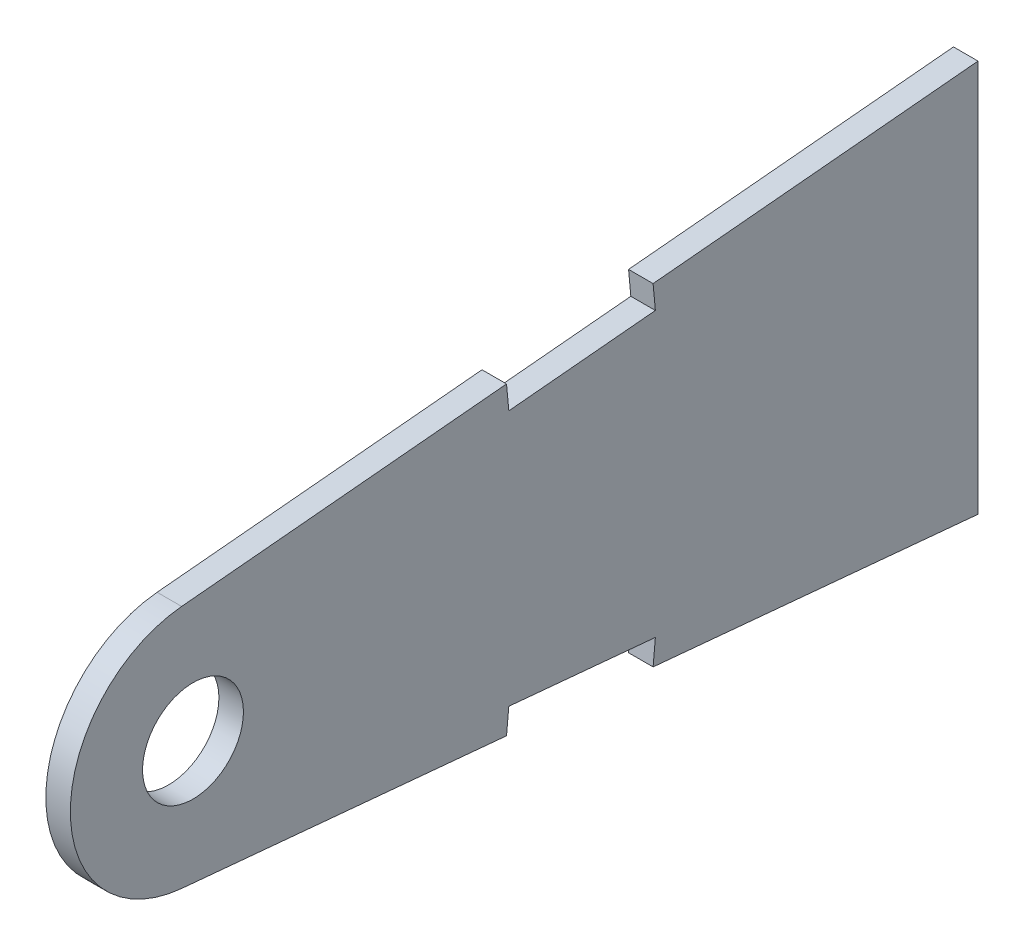
ISO-10303-21;
HEADER;
FILE_DESCRIPTION(('STEP AP214'),'2;1');
FILE_NAME('part.step','',(''),(''),'','','');
FILE_SCHEMA(('AUTOMOTIVE_DESIGN { 1 0 10303 214 1 1 1 1 }'));
ENDSEC;
DATA;
#1=APPLICATION_CONTEXT('core data for automotive mechanical design processes');
#2=APPLICATION_PROTOCOL_DEFINITION('international standard','automotive_design',2000,#1);
#3=PRODUCT_CONTEXT('',#1,'mechanical');
#4=PRODUCT('Part','Part','',(#3));
#5=PRODUCT_RELATED_PRODUCT_CATEGORY('part','',(#4));
#6=PRODUCT_DEFINITION_FORMATION('','',#4);
#7=PRODUCT_DEFINITION_CONTEXT('part definition',#1,'design');
#8=PRODUCT_DEFINITION('design','',#6,#7);
#9=PRODUCT_DEFINITION_SHAPE('','',#8);
#10=(LENGTH_UNIT() NAMED_UNIT(*) SI_UNIT(.MILLI.,.METRE.));
#11=(NAMED_UNIT(*) PLANE_ANGLE_UNIT() SI_UNIT($,.RADIAN.));
#12=(NAMED_UNIT(*) SI_UNIT($,.STERADIAN.) SOLID_ANGLE_UNIT());
#13=UNCERTAINTY_MEASURE_WITH_UNIT(LENGTH_MEASURE(1.E-05),#10,'distance_accuracy_value','');
#14=(GEOMETRIC_REPRESENTATION_CONTEXT(3) GLOBAL_UNCERTAINTY_ASSIGNED_CONTEXT((#13)) GLOBAL_UNIT_ASSIGNED_CONTEXT((#10,
#11,#12)) REPRESENTATION_CONTEXT('',''));
#15=CARTESIAN_POINT('',(0.,0.,0.));
#16=DIRECTION('',(0.,0.,1.));
#17=DIRECTION('',(1.,0.,0.));
#18=AXIS2_PLACEMENT_3D('',#15,#16,#17);
#19=CARTESIAN_POINT('',(1.5875,0.,0.));
#20=DIRECTION('',(-1.,0.,0.));
#21=DIRECTION('',(0.,0.,1.));
#22=AXIS2_PLACEMENT_3D('',#19,#20,#21);
#23=CYLINDRICAL_SURFACE('',#22,7.93750000000001);
#24=CARTESIAN_POINT('',(0.,0.,0.));
#25=DIRECTION('',(1.,0.,0.));
#26=DIRECTION('',(0.,0.,-1.));
#27=AXIS2_PLACEMENT_3D('',#24,#25,#26);
#28=CIRCLE('',#27,7.93750000000001);
#29=CARTESIAN_POINT('',(0.,7.90334091594281,0.735600853985699));
#30=VERTEX_POINT('',#29);
#31=CARTESIAN_POINT('',(0.,-7.90334091594281,0.735600853985699));
#32=VERTEX_POINT('',#31);
#33=EDGE_CURVE('E153',#30,#32,#28,.T.);
#34=ORIENTED_EDGE('',*,*,#33,.T.);
#35=DIRECTION('',(-1.,0.,0.));
#36=VECTOR('',#35,1.);
#37=CARTESIAN_POINT('',(1.5875,-7.90334091594281,0.735600853985699));
#38=LINE('',#37,#36);
#39=CARTESIAN_POINT('',(1.5875,-7.90334091594281,0.735600853985699));
#40=VERTEX_POINT('',#39);
#41=EDGE_CURVE('E11',#40,#32,#38,.T.);
#42=ORIENTED_EDGE('',*,*,#41,.F.);
#43=CARTESIAN_POINT('',(1.5875,0.,0.));
#44=DIRECTION('',(1.,0.,0.));
#45=DIRECTION('',(0.,0.,-1.));
#46=AXIS2_PLACEMENT_3D('',#43,#44,#45);
#47=CIRCLE('',#46,7.93750000000001);
#48=CARTESIAN_POINT('',(1.5875,7.90334091594281,0.735600853985699));
#49=VERTEX_POINT('',#48);
#50=EDGE_CURVE('E234',#49,#40,#47,.T.);
#51=ORIENTED_EDGE('',*,*,#50,.F.);
#52=DIRECTION('',(-1.,0.,0.));
#53=VECTOR('',#52,1.);
#54=CARTESIAN_POINT('',(1.5875,7.90334091594281,0.735600853985699));
#55=LINE('',#54,#53);
#56=EDGE_CURVE('E148',#49,#30,#55,.T.);
#57=ORIENTED_EDGE('',*,*,#56,.T.);
#58=EDGE_LOOP('',(#34,#42,#51,#57));
#59=FACE_BOUND('',#58,.T.);
#60=ADVANCED_FACE('F34',(#59),#23,.T.);
#61=CARTESIAN_POINT('',(1.5875,-7.90334091594281,0.735600853985698));
#62=DIRECTION('',(0.,0.995696493347124,-0.0926741233367807));
#63=DIRECTION('',(0.,0.0926741233367807,0.995696493347124));
#64=AXIS2_PLACEMENT_3D('',#61,#62,#63);
#65=PLANE('',#64);
#66=DIRECTION('',(0.,-0.0926741233367807,-0.995696493347124));
#67=VECTOR('',#66,1.);
#68=CARTESIAN_POINT('',(0.,-7.90334091594281,0.735600853985698));
#69=LINE('',#68,#67);
#70=CARTESIAN_POINT('',(0.,-9.86030994557999,-20.2901950234415));
#71=VERTEX_POINT('',#70);
#72=EDGE_CURVE('E156',#32,#71,#69,.T.);
#73=ORIENTED_EDGE('',*,*,#72,.T.);
#74=DIRECTION('',(-1.,0.,0.));
#75=VECTOR('',#74,1.);
#76=CARTESIAN_POINT('',(1.5875,-9.86030994557999,-20.2901950234415));
#77=LINE('',#76,#75);
#78=CARTESIAN_POINT('',(1.5875,-9.86030994557999,-20.2901950234415));
#79=VERTEX_POINT('',#78);
#80=EDGE_CURVE('E42',#79,#71,#77,.T.);
#81=ORIENTED_EDGE('',*,*,#80,.F.);
#82=DIRECTION('',(0.,-0.0926741233367807,-0.995696493347124));
#83=VECTOR('',#82,1.);
#84=CARTESIAN_POINT('',(1.5875,-7.90334091594281,0.735600853985698));
#85=LINE('',#84,#83);
#86=EDGE_CURVE('E101',#40,#79,#85,.T.);
#87=ORIENTED_EDGE('',*,*,#86,.F.);
#88=ORIENTED_EDGE('',*,*,#41,.T.);
#89=EDGE_LOOP('',(#73,#81,#87,#88));
#90=FACE_BOUND('',#89,.T.);
#91=ADVANCED_FACE('F259',(#90),#65,.F.);
#92=CARTESIAN_POINT('',(1.5875,-1.95696902963718,-21.0257958774272));
#93=DIRECTION('',(0.,0.0926741233367808,0.995696493347124));
#94=DIRECTION('',(0.,-0.995696493347124,0.0926741233367808));
#95=AXIS2_PLACEMENT_3D('',#92,#93,#94);
#96=PLANE('',#95);
#97=DIRECTION('',(0.,0.995696493347124,-0.0926741233367808));
#98=VECTOR('',#97,1.);
#99=CARTESIAN_POINT('',(0.,-1.95696902963718,-21.0257958774272));
#100=LINE('',#99,#98);
#101=CARTESIAN_POINT('',(0.,-8.27964176239126,-20.4373151942386));
#102=VERTEX_POINT('',#101);
#103=EDGE_CURVE('E159',#71,#102,#100,.T.);
#104=ORIENTED_EDGE('',*,*,#103,.T.);
#105=DIRECTION('',(-1.,0.,0.));
#106=VECTOR('',#105,1.);
#107=CARTESIAN_POINT('',(1.5875,-8.27964176239126,-20.4373151942386));
#108=LINE('',#107,#106);
#109=CARTESIAN_POINT('',(1.5875,-8.27964176239126,-20.4373151942386));
#110=VERTEX_POINT('',#109);
#111=EDGE_CURVE('E194',#110,#102,#108,.T.);
#112=ORIENTED_EDGE('',*,*,#111,.F.);
#113=DIRECTION('',(0.,0.995696493347124,-0.0926741233367808));
#114=VECTOR('',#113,1.);
#115=CARTESIAN_POINT('',(1.5875,-1.95696902963718,-21.0257958774272));
#116=LINE('',#115,#114);
#117=EDGE_CURVE('E202',#79,#110,#116,.T.);
#118=ORIENTED_EDGE('',*,*,#117,.F.);
#119=ORIENTED_EDGE('',*,*,#80,.T.);
#120=EDGE_LOOP('',(#104,#112,#118,#119));
#121=FACE_BOUND('',#120,.T.);
#122=ADVANCED_FACE('F200',(#121),#96,.F.);
#123=CARTESIAN_POINT('',(1.5875,-6.32267273275409,0.588480683188544));
#124=DIRECTION('',(0.,0.995696493347124,-0.0926741233367807));
#125=DIRECTION('',(0.,0.0926741233367807,0.995696493347124));
#126=AXIS2_PLACEMENT_3D('',#123,#124,#125);
#127=PLANE('',#126);
#128=DIRECTION('',(0.,-0.0926741233367807,-0.995696493347124));
#129=VECTOR('',#128,1.);
#130=CARTESIAN_POINT('',(0.,-6.32267273275409,0.588480683188544));
#131=LINE('',#130,#129);
#132=CARTESIAN_POINT('',(0.,-9.1623627871741,-29.92132429337));
#133=VERTEX_POINT('',#132);
#134=EDGE_CURVE('E162',#102,#133,#131,.T.);
#135=ORIENTED_EDGE('',*,*,#134,.T.);
#136=DIRECTION('',(-1.,0.,0.));
#137=VECTOR('',#136,1.);
#138=CARTESIAN_POINT('',(1.5875,-9.1623627871741,-29.92132429337));
#139=LINE('',#138,#137);
#140=CARTESIAN_POINT('',(1.5875,-9.1623627871741,-29.92132429337));
#141=VERTEX_POINT('',#140);
#142=EDGE_CURVE('E192',#141,#133,#139,.T.);
#143=ORIENTED_EDGE('',*,*,#142,.F.);
#144=DIRECTION('',(0.,-0.0926741233367807,-0.995696493347124));
#145=VECTOR('',#144,1.);
#146=CARTESIAN_POINT('',(1.5875,-6.32267273275409,0.588480683188544));
#147=LINE('',#146,#145);
#148=EDGE_CURVE('E214',#110,#141,#147,.T.);
#149=ORIENTED_EDGE('',*,*,#148,.F.);
#150=ORIENTED_EDGE('',*,*,#111,.T.);
#151=EDGE_LOOP('',(#135,#143,#149,#150));
#152=FACE_BOUND('',#151,.T.);
#153=ADVANCED_FACE('F211',(#152),#127,.F.);
#154=CARTESIAN_POINT('',(1.5875,-2.83969005442002,-30.5098049765585));
#155=DIRECTION('',(0.,0.0926741233367808,0.995696493347124));
#156=DIRECTION('',(0.,-0.995696493347124,0.0926741233367808));
#157=AXIS2_PLACEMENT_3D('',#154,#155,#156);
#158=PLANE('',#157);
#159=DIRECTION('',(0.,0.995696493347124,-0.0926741233367808));
#160=VECTOR('',#159,1.);
#161=CARTESIAN_POINT('',(0.,-2.83969005442002,-30.5098049765585));
#162=LINE('',#161,#160);
#163=CARTESIAN_POINT('',(0.,-10.7430309703628,-29.7742041225728));
#164=VERTEX_POINT('',#163);
#165=EDGE_CURVE('E165',#164,#133,#162,.T.);
#166=ORIENTED_EDGE('',*,*,#165,.F.);
#167=DIRECTION('',(-1.,0.,0.));
#168=VECTOR('',#167,1.);
#169=CARTESIAN_POINT('',(1.5875,-10.7430309703628,-29.7742041225728));
#170=LINE('',#169,#168);
#171=CARTESIAN_POINT('',(1.5875,-10.7430309703628,-29.7742041225728));
#172=VERTEX_POINT('',#171);
#173=EDGE_CURVE('E190',#172,#164,#170,.T.);
#174=ORIENTED_EDGE('',*,*,#173,.F.);
#175=DIRECTION('',(0.,0.995696493347124,-0.0926741233367808));
#176=VECTOR('',#175,1.);
#177=CARTESIAN_POINT('',(1.5875,-2.83969005442002,-30.5098049765585));
#178=LINE('',#177,#176);
#179=EDGE_CURVE('E216',#172,#141,#178,.T.);
#180=ORIENTED_EDGE('',*,*,#179,.T.);
#181=ORIENTED_EDGE('',*,*,#142,.T.);
#182=EDGE_LOOP('',(#166,#174,#180,#181));
#183=FACE_BOUND('',#182,.T.);
#184=ADVANCED_FACE('F273',(#183),#158,.T.);
#185=CARTESIAN_POINT('',(0.,-12.7,-50.8));
#186=VERTEX_POINT('',#185);
#187=EDGE_CURVE('E160',#164,#186,#69,.T.);
#188=ORIENTED_EDGE('',*,*,#187,.T.);
#189=DIRECTION('',(-1.,0.,0.));
#190=VECTOR('',#189,1.);
#191=CARTESIAN_POINT('',(1.5875,-12.7,-50.8));
#192=LINE('',#191,#190);
#193=CARTESIAN_POINT('',(1.5875,-12.7,-50.8));
#194=VERTEX_POINT('',#193);
#195=EDGE_CURVE('E187',#194,#186,#192,.T.);
#196=ORIENTED_EDGE('',*,*,#195,.F.);
#197=EDGE_CURVE('E218',#172,#194,#85,.T.);
#198=ORIENTED_EDGE('',*,*,#197,.F.);
#199=ORIENTED_EDGE('',*,*,#173,.T.);
#200=EDGE_LOOP('',(#188,#196,#198,#199));
#201=FACE_BOUND('',#200,.T.);
#202=ADVANCED_FACE('F265',(#201),#65,.F.);
#203=CARTESIAN_POINT('',(1.5875,0.,-50.8));
#204=DIRECTION('',(0.,0.,1.));
#205=DIRECTION('',(1.,0.,0.));
#206=AXIS2_PLACEMENT_3D('',#203,#204,#205);
#207=PLANE('',#206);
#208=DIRECTION('',(0.,1.,0.));
#209=VECTOR('',#208,1.);
#210=CARTESIAN_POINT('',(0.,0.,-50.8));
#211=LINE('',#210,#209);
#212=CARTESIAN_POINT('',(0.,12.7,-50.8));
#213=VERTEX_POINT('',#212);
#214=EDGE_CURVE('E168',#186,#213,#211,.T.);
#215=ORIENTED_EDGE('',*,*,#214,.T.);
#216=DIRECTION('',(-1.,0.,0.));
#217=VECTOR('',#216,1.);
#218=CARTESIAN_POINT('',(1.5875,12.7,-50.8));
#219=LINE('',#218,#217);
#220=CARTESIAN_POINT('',(1.5875,12.7,-50.8));
#221=VERTEX_POINT('',#220);
#222=EDGE_CURVE('E184',#221,#213,#219,.T.);
#223=ORIENTED_EDGE('',*,*,#222,.F.);
#224=DIRECTION('',(0.,1.,0.));
#225=VECTOR('',#224,1.);
#226=CARTESIAN_POINT('',(1.5875,0.,-50.8));
#227=LINE('',#226,#225);
#228=EDGE_CURVE('E223',#194,#221,#227,.T.);
#229=ORIENTED_EDGE('',*,*,#228,.F.);
#230=ORIENTED_EDGE('',*,*,#195,.T.);
#231=EDGE_LOOP('',(#215,#223,#229,#230));
#232=FACE_BOUND('',#231,.T.);
#233=ADVANCED_FACE('F272',(#232),#207,.F.);
#234=CARTESIAN_POINT('',(1.5875,7.90334091594281,0.735600853985698));
#235=DIRECTION('',(0.,-0.995696493347124,-0.0926741233367807));
#236=DIRECTION('',(0.,0.0926741233367807,-0.995696493347124));
#237=AXIS2_PLACEMENT_3D('',#234,#235,#236);
#238=PLANE('',#237);
#239=DIRECTION('',(0.,-0.0926741233367807,0.995696493347124));
#240=VECTOR('',#239,1.);
#241=CARTESIAN_POINT('',(0.,7.90334091594281,0.735600853985698));
#242=LINE('',#241,#240);
#243=CARTESIAN_POINT('',(0.,10.7430309703628,-29.7742041225728));
#244=VERTEX_POINT('',#243);
#245=EDGE_CURVE('E170',#213,#244,#242,.T.);
#246=ORIENTED_EDGE('',*,*,#245,.T.);
#247=DIRECTION('',(-1.,0.,0.));
#248=VECTOR('',#247,1.);
#249=CARTESIAN_POINT('',(1.5875,10.7430309703628,-29.7742041225728));
#250=LINE('',#249,#248);
#251=CARTESIAN_POINT('',(1.5875,10.7430309703628,-29.7742041225728));
#252=VERTEX_POINT('',#251);
#253=EDGE_CURVE('E181',#252,#244,#250,.T.);
#254=ORIENTED_EDGE('',*,*,#253,.F.);
#255=DIRECTION('',(0.,-0.0926741233367807,0.995696493347124));
#256=VECTOR('',#255,1.);
#257=CARTESIAN_POINT('',(1.5875,7.90334091594281,0.735600853985698));
#258=LINE('',#257,#256);
#259=EDGE_CURVE('E150',#221,#252,#258,.T.);
#260=ORIENTED_EDGE('',*,*,#259,.F.);
#261=ORIENTED_EDGE('',*,*,#222,.T.);
#262=EDGE_LOOP('',(#246,#254,#260,#261));
#263=FACE_BOUND('',#262,.T.);
#264=ADVANCED_FACE('F229',(#263),#238,.F.);
#265=CARTESIAN_POINT('',(1.5875,2.83969005442002,-30.5098049765585));
#266=DIRECTION('',(0.,0.0926741233367808,-0.995696493347124));
#267=DIRECTION('',(0.,0.995696493347124,0.0926741233367808));
#268=AXIS2_PLACEMENT_3D('',#265,#266,#267);
#269=PLANE('',#268);
#270=DIRECTION('',(0.,-0.995696493347124,-0.0926741233367808));
#271=VECTOR('',#270,1.);
#272=CARTESIAN_POINT('',(0.,2.83969005442002,-30.5098049765585));
#273=LINE('',#272,#271);
#274=CARTESIAN_POINT('',(0.,9.1623627871741,-29.92132429337));
#275=VERTEX_POINT('',#274);
#276=EDGE_CURVE('E172',#244,#275,#273,.T.);
#277=ORIENTED_EDGE('',*,*,#276,.T.);
#278=DIRECTION('',(-1.,0.,0.));
#279=VECTOR('',#278,1.);
#280=CARTESIAN_POINT('',(1.5875,9.1623627871741,-29.92132429337));
#281=LINE('',#280,#279);
#282=CARTESIAN_POINT('',(1.5875,9.1623627871741,-29.92132429337));
#283=VERTEX_POINT('',#282);
#284=EDGE_CURVE('E138',#283,#275,#281,.T.);
#285=ORIENTED_EDGE('',*,*,#284,.F.);
#286=DIRECTION('',(0.,-0.995696493347124,-0.0926741233367808));
#287=VECTOR('',#286,1.);
#288=CARTESIAN_POINT('',(1.5875,2.83969005442002,-30.5098049765585));
#289=LINE('',#288,#287);
#290=EDGE_CURVE('E143',#252,#283,#289,.T.);
#291=ORIENTED_EDGE('',*,*,#290,.F.);
#292=ORIENTED_EDGE('',*,*,#253,.T.);
#293=EDGE_LOOP('',(#277,#285,#291,#292));
#294=FACE_BOUND('',#293,.T.);
#295=ADVANCED_FACE('F233',(#294),#269,.F.);
#296=CARTESIAN_POINT('',(1.5875,6.32267273275409,0.588480683188544));
#297=DIRECTION('',(0.,0.995696493347124,0.0926741233367807));
#298=DIRECTION('',(0.,-0.0926741233367807,0.995696493347124));
#299=AXIS2_PLACEMENT_3D('',#296,#297,#298);
#300=PLANE('',#299);
#301=DIRECTION('',(0.,0.0926741233367807,-0.995696493347124));
#302=VECTOR('',#301,1.);
#303=CARTESIAN_POINT('',(0.,6.32267273275409,0.588480683188544));
#304=LINE('',#303,#302);
#305=CARTESIAN_POINT('',(0.,8.27964176239126,-20.4373151942386));
#306=VERTEX_POINT('',#305);
#307=EDGE_CURVE('E133',#306,#275,#304,.T.);
#308=ORIENTED_EDGE('',*,*,#307,.F.);
#309=DIRECTION('',(-1.,0.,0.));
#310=VECTOR('',#309,1.);
#311=CARTESIAN_POINT('',(1.5875,8.27964176239126,-20.4373151942386));
#312=LINE('',#311,#310);
#313=CARTESIAN_POINT('',(1.5875,8.27964176239126,-20.4373151942386));
#314=VERTEX_POINT('',#313);
#315=EDGE_CURVE('E128',#314,#306,#312,.T.);
#316=ORIENTED_EDGE('',*,*,#315,.F.);
#317=DIRECTION('',(0.,0.0926741233367807,-0.995696493347124));
#318=VECTOR('',#317,1.);
#319=CARTESIAN_POINT('',(1.5875,6.32267273275409,0.588480683188544));
#320=LINE('',#319,#318);
#321=EDGE_CURVE('E131',#314,#283,#320,.T.);
#322=ORIENTED_EDGE('',*,*,#321,.T.);
#323=ORIENTED_EDGE('',*,*,#284,.T.);
#324=EDGE_LOOP('',(#308,#316,#322,#323));
#325=FACE_BOUND('',#324,.T.);
#326=ADVANCED_FACE('F130',(#325),#300,.T.);
#327=CARTESIAN_POINT('',(1.5875,1.95696902963718,-21.0257958774272));
#328=DIRECTION('',(0.,0.0926741233367808,-0.995696493347124));
#329=DIRECTION('',(0.,0.995696493347124,0.0926741233367808));
#330=AXIS2_PLACEMENT_3D('',#327,#328,#329);
#331=PLANE('',#330);
#332=DIRECTION('',(0.,-0.995696493347124,-0.0926741233367808));
#333=VECTOR('',#332,1.);
#334=CARTESIAN_POINT('',(0.,1.95696902963718,-21.0257958774272));
#335=LINE('',#334,#333);
#336=CARTESIAN_POINT('',(0.,9.86030994557999,-20.2901950234415));
#337=VERTEX_POINT('',#336);
#338=EDGE_CURVE('E176',#337,#306,#335,.T.);
#339=ORIENTED_EDGE('',*,*,#338,.F.);
#340=DIRECTION('',(-1.,0.,0.));
#341=VECTOR('',#340,1.);
#342=CARTESIAN_POINT('',(1.5875,9.86030994557999,-20.2901950234415));
#343=LINE('',#342,#341);
#344=CARTESIAN_POINT('',(1.5875,9.86030994557999,-20.2901950234415));
#345=VERTEX_POINT('',#344);
#346=EDGE_CURVE('E90',#345,#337,#343,.T.);
#347=ORIENTED_EDGE('',*,*,#346,.F.);
#348=DIRECTION('',(0.,-0.995696493347124,-0.0926741233367808));
#349=VECTOR('',#348,1.);
#350=CARTESIAN_POINT('',(1.5875,1.95696902963718,-21.0257958774272));
#351=LINE('',#350,#349);
#352=EDGE_CURVE('E141',#345,#314,#351,.T.);
#353=ORIENTED_EDGE('',*,*,#352,.T.);
#354=ORIENTED_EDGE('',*,*,#315,.T.);
#355=EDGE_LOOP('',(#339,#347,#353,#354));
#356=FACE_BOUND('',#355,.T.);
#357=ADVANCED_FACE('F146',(#356),#331,.T.);
#358=EDGE_CURVE('E93',#337,#30,#242,.T.);
#359=ORIENTED_EDGE('',*,*,#358,.T.);
#360=ORIENTED_EDGE('',*,*,#56,.F.);
#361=EDGE_CURVE('E50',#345,#49,#258,.T.);
#362=ORIENTED_EDGE('',*,*,#361,.F.);
#363=ORIENTED_EDGE('',*,*,#346,.T.);
#364=EDGE_LOOP('',(#359,#360,#362,#363));
#365=FACE_BOUND('',#364,.T.);
#366=ADVANCED_FACE('F248',(#365),#238,.F.);
#367=CARTESIAN_POINT('',(1.5875,0.,0.));
#368=DIRECTION('',(1.,0.,0.));
#369=DIRECTION('',(0.,0.,-1.));
#370=AXIS2_PLACEMENT_3D('',#367,#368,#369);
#371=PLANE('',#370);
#372=CARTESIAN_POINT('',(1.5875,0.,0.));
#373=DIRECTION('',(1.,0.,0.));
#374=DIRECTION('',(0.,0.,-1.));
#375=AXIS2_PLACEMENT_3D('',#372,#373,#374);
#376=CIRCLE('',#375,3.2639);
#377=CARTESIAN_POINT('',(1.5875,0.,-3.2639));
#378=VERTEX_POINT('',#377);
#379=EDGE_CURVE('E241',#378,#378,#376,.T.);
#380=ORIENTED_EDGE('',*,*,#379,.F.);
#381=EDGE_LOOP('',(#380));
#382=FACE_BOUND('',#381,.T.);
#383=ORIENTED_EDGE('',*,*,#50,.T.);
#384=ORIENTED_EDGE('',*,*,#86,.T.);
#385=ORIENTED_EDGE('',*,*,#117,.T.);
#386=ORIENTED_EDGE('',*,*,#148,.T.);
#387=ORIENTED_EDGE('',*,*,#179,.F.);
#388=ORIENTED_EDGE('',*,*,#197,.T.);
#389=ORIENTED_EDGE('',*,*,#228,.T.);
#390=ORIENTED_EDGE('',*,*,#259,.T.);
#391=ORIENTED_EDGE('',*,*,#290,.T.);
#392=ORIENTED_EDGE('',*,*,#321,.F.);
#393=ORIENTED_EDGE('',*,*,#352,.F.);
#394=ORIENTED_EDGE('',*,*,#361,.T.);
#395=EDGE_LOOP('',(#383,#384,#385,#386,#387,#388,#389,#390,#391,#392,#393,#394));
#396=FACE_BOUND('',#395,.T.);
#397=ADVANCED_FACE('F140',(#382,#396),#371,.T.);
#398=CARTESIAN_POINT('',(0.,0.,0.));
#399=DIRECTION('',(1.,0.,0.));
#400=DIRECTION('',(0.,0.,-1.));
#401=AXIS2_PLACEMENT_3D('',#398,#399,#400);
#402=PLANE('',#401);
#403=CARTESIAN_POINT('',(0.,0.,0.));
#404=DIRECTION('',(1.,0.,0.));
#405=DIRECTION('',(0.,0.,-1.));
#406=AXIS2_PLACEMENT_3D('',#403,#404,#405);
#407=CIRCLE('',#406,3.2639);
#408=CARTESIAN_POINT('',(0.,0.,-3.2639));
#409=VERTEX_POINT('',#408);
#410=EDGE_CURVE('E157',#409,#409,#407,.T.);
#411=ORIENTED_EDGE('',*,*,#410,.T.);
#412=EDGE_LOOP('',(#411));
#413=FACE_BOUND('',#412,.T.);
#414=ORIENTED_EDGE('',*,*,#33,.F.);
#415=ORIENTED_EDGE('',*,*,#358,.F.);
#416=ORIENTED_EDGE('',*,*,#338,.T.);
#417=ORIENTED_EDGE('',*,*,#307,.T.);
#418=ORIENTED_EDGE('',*,*,#276,.F.);
#419=ORIENTED_EDGE('',*,*,#245,.F.);
#420=ORIENTED_EDGE('',*,*,#214,.F.);
#421=ORIENTED_EDGE('',*,*,#187,.F.);
#422=ORIENTED_EDGE('',*,*,#165,.T.);
#423=ORIENTED_EDGE('',*,*,#134,.F.);
#424=ORIENTED_EDGE('',*,*,#103,.F.);
#425=ORIENTED_EDGE('',*,*,#72,.F.);
#426=EDGE_LOOP('',(#414,#415,#416,#417,#418,#419,#420,#421,#422,#423,#424,#425));
#427=FACE_BOUND('',#426,.T.);
#428=ADVANCED_FACE('F206',(#413,#427),#402,.F.);
#429=CARTESIAN_POINT('',(1.5875,0.,0.));
#430=DIRECTION('',(1.,0.,0.));
#431=DIRECTION('',(0.,0.,-1.));
#432=AXIS2_PLACEMENT_3D('',#429,#430,#431);
#433=CYLINDRICAL_SURFACE('',#432,3.2639);
#434=ORIENTED_EDGE('',*,*,#410,.F.);
#435=EDGE_LOOP('',(#434));
#436=FACE_BOUND('',#435,.T.);
#437=ORIENTED_EDGE('',*,*,#379,.T.);
#438=EDGE_LOOP('',(#437));
#439=FACE_BOUND('',#438,.T.);
#440=ADVANCED_FACE('F245',(#436,#439),#433,.F.);
#441=CLOSED_SHELL('',(#60,#91,#122,#153,#184,#202,#233,#264,#295,#326,#357,#366,#397,#428,#440));
#442=MANIFOLD_SOLID_BREP('B2',#441);
#443=ADVANCED_BREP_SHAPE_REPRESENTATION('',(#18,#442),#14);
#444=SHAPE_DEFINITION_REPRESENTATION(#9,#443);
ENDSEC;
END-ISO-10303-21;
